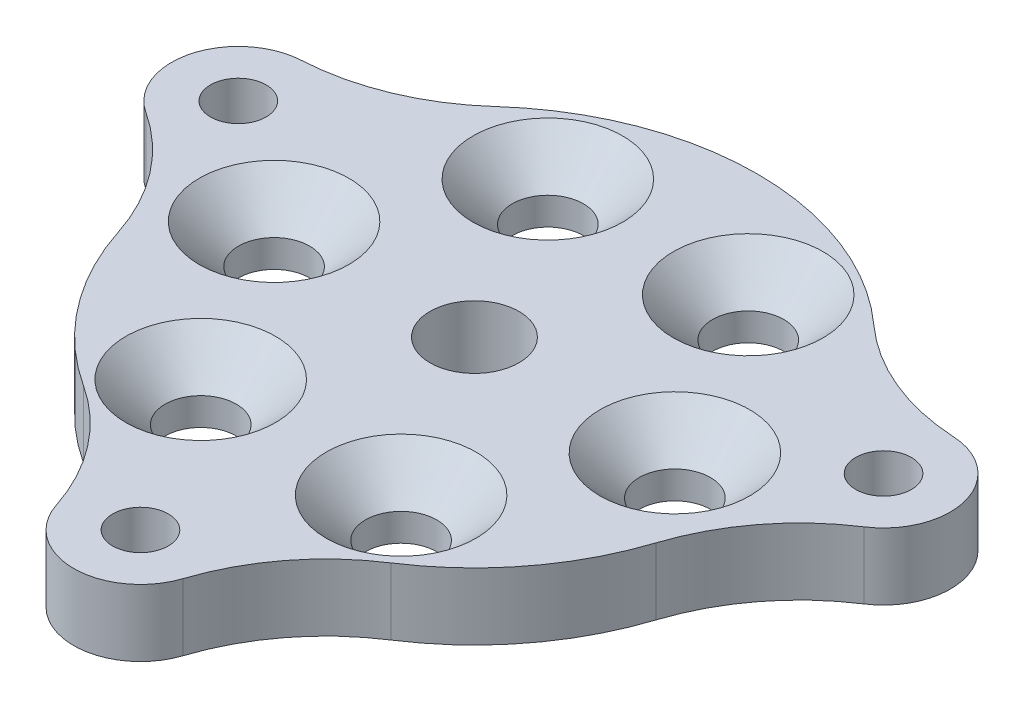
ISO-10303-21;
HEADER;
FILE_DESCRIPTION(('STEP AP214'),'2;1');
FILE_NAME('part.step','',(''),(''),'','','');
FILE_SCHEMA(('AUTOMOTIVE_DESIGN { 1 0 10303 214 1 1 1 1 }'));
ENDSEC;
DATA;
#1=APPLICATION_CONTEXT('core data for automotive mechanical design processes');
#2=APPLICATION_PROTOCOL_DEFINITION('international standard','automotive_design',2000,#1);
#3=PRODUCT_CONTEXT('',#1,'mechanical');
#4=PRODUCT('Part','Part','',(#3));
#5=PRODUCT_RELATED_PRODUCT_CATEGORY('part','',(#4));
#6=PRODUCT_DEFINITION_FORMATION('','',#4);
#7=PRODUCT_DEFINITION_CONTEXT('part definition',#1,'design');
#8=PRODUCT_DEFINITION('design','',#6,#7);
#9=PRODUCT_DEFINITION_SHAPE('','',#8);
#10=(LENGTH_UNIT() NAMED_UNIT(*) SI_UNIT(.MILLI.,.METRE.));
#11=(NAMED_UNIT(*) PLANE_ANGLE_UNIT() SI_UNIT($,.RADIAN.));
#12=(NAMED_UNIT(*) SI_UNIT($,.STERADIAN.) SOLID_ANGLE_UNIT());
#13=UNCERTAINTY_MEASURE_WITH_UNIT(LENGTH_MEASURE(1.E-05),#10,'distance_accuracy_value','');
#14=(GEOMETRIC_REPRESENTATION_CONTEXT(3) GLOBAL_UNCERTAINTY_ASSIGNED_CONTEXT((#13)) GLOBAL_UNIT_ASSIGNED_CONTEXT((#10,
#11,#12)) REPRESENTATION_CONTEXT('',''));
#15=CARTESIAN_POINT('',(0.,0.,0.));
#16=DIRECTION('',(0.,0.,1.));
#17=DIRECTION('',(1.,0.,0.));
#18=AXIS2_PLACEMENT_3D('',#15,#16,#17);
#19=CARTESIAN_POINT('',(0.,3.,0.));
#20=DIRECTION('',(0.,-1.,0.));
#21=DIRECTION('',(0.,0.,-1.));
#22=AXIS2_PLACEMENT_3D('',#19,#20,#21);
#23=CYLINDRICAL_SURFACE('',#22,12.7);
#24=CARTESIAN_POINT('',(0.,0.,0.));
#25=DIRECTION('',(0.,1.,0.));
#26=DIRECTION('',(0.,0.,1.));
#27=AXIS2_PLACEMENT_3D('',#24,#25,#26);
#28=CIRCLE('',#27,12.7);
#29=CARTESIAN_POINT('',(8.50191211044675,0.,-9.43437811762063));
#30=VERTEX_POINT('',#29);
#31=CARTESIAN_POINT('',(-8.50191211044675,0.,-9.43437811762062));
#32=VERTEX_POINT('',#31);
#33=EDGE_CURVE('E204',#30,#32,#28,.T.);
#34=ORIENTED_EDGE('',*,*,#33,.T.);
#35=DIRECTION('',(0.,-1.,0.));
#36=VECTOR('',#35,1.);
#37=CARTESIAN_POINT('',(-8.50191211044675,3.,-9.43437811762062));
#38=LINE('',#37,#36);
#39=CARTESIAN_POINT('',(-8.50191211044675,3.,-9.43437811762062));
#40=VERTEX_POINT('',#39);
#41=EDGE_CURVE('E162',#32,#40,#38,.F.);
#42=ORIENTED_EDGE('',*,*,#41,.T.);
#43=CARTESIAN_POINT('',(0.,3.,0.));
#44=DIRECTION('',(0.,1.,0.));
#45=DIRECTION('',(0.,0.,1.));
#46=AXIS2_PLACEMENT_3D('',#43,#44,#45);
#47=CIRCLE('',#46,12.7);
#48=CARTESIAN_POINT('',(8.50191211044675,3.,-9.43437811762063));
#49=VERTEX_POINT('',#48);
#50=EDGE_CURVE('E147',#49,#40,#47,.T.);
#51=ORIENTED_EDGE('',*,*,#50,.F.);
#52=DIRECTION('',(0.,-1.,0.));
#53=VECTOR('',#52,1.);
#54=CARTESIAN_POINT('',(8.50191211044675,3.,-9.43437811762063));
#55=LINE('',#54,#53);
#56=EDGE_CURVE('E159',#49,#30,#55,.T.);
#57=ORIENTED_EDGE('',*,*,#56,.T.);
#58=EDGE_LOOP('',(#34,#42,#51,#57));
#59=FACE_BOUND('',#58,.T.);
#60=ADVANCED_FACE('F37',(#59),#23,.T.);
#61=CARTESIAN_POINT('',(-12.0800609271998,3.,3.919455063544));
#62=VERTEX_POINT('',#61);
#63=CARTESIAN_POINT('',(-6.91245270481478,3.,10.654013215859));
#64=VERTEX_POINT('',#63);
#65=EDGE_CURVE('E129',#62,#64,#47,.T.);
#66=ORIENTED_EDGE('',*,*,#65,.F.);
#67=DIRECTION('',(0.,-1.,0.));
#68=VECTOR('',#67,1.);
#69=CARTESIAN_POINT('',(-12.0800609271998,3.,3.919455063544));
#70=LINE('',#69,#68);
#71=CARTESIAN_POINT('',(-12.0800609271998,0.,3.919455063544));
#72=VERTEX_POINT('',#71);
#73=EDGE_CURVE('E143',#62,#72,#70,.T.);
#74=ORIENTED_EDGE('',*,*,#73,.T.);
#75=CARTESIAN_POINT('',(-6.91245270481478,0.,10.654013215859));
#76=VERTEX_POINT('',#75);
#77=EDGE_CURVE('E285',#72,#76,#28,.T.);
#78=ORIENTED_EDGE('',*,*,#77,.T.);
#79=DIRECTION('',(0.,-1.,0.));
#80=VECTOR('',#79,1.);
#81=CARTESIAN_POINT('',(-6.91245270481478,3.,10.654013215859));
#82=LINE('',#81,#80);
#83=EDGE_CURVE('E146',#76,#64,#82,.F.);
#84=ORIENTED_EDGE('',*,*,#83,.T.);
#85=EDGE_LOOP('',(#66,#74,#78,#84));
#86=FACE_BOUND('',#85,.T.);
#87=ADVANCED_FACE('F141',(#86),#23,.T.);
#88=CARTESIAN_POINT('',(0.,3.,0.));
#89=DIRECTION('',(0.,1.,0.));
#90=DIRECTION('',(0.,0.,1.));
#91=AXIS2_PLACEMENT_3D('',#88,#89,#90);
#92=PLANE('',#91);
#93=CARTESIAN_POINT('',(-14.488887394336,3.,-3.88228567653787));
#94=DIRECTION('',(0.,1.,0.));
#95=DIRECTION('',(0.,0.,1.));
#96=AXIS2_PLACEMENT_3D('',#93,#94,#95);
#97=CIRCLE('',#96,1.25);
#98=CARTESIAN_POINT('',(-14.488887394336,3.,-2.63228567653787));
#99=VERTEX_POINT('',#98);
#100=EDGE_CURVE('E317',#99,#99,#97,.T.);
#101=ORIENTED_EDGE('',*,*,#100,.F.);
#102=EDGE_LOOP('',(#101));
#103=FACE_BOUND('',#102,.T.);
#104=CARTESIAN_POINT('',(14.488887394336,3.,-3.88228567653788));
#105=DIRECTION('',(0.,1.,0.));
#106=DIRECTION('',(0.,0.,1.));
#107=AXIS2_PLACEMENT_3D('',#104,#105,#106);
#108=CIRCLE('',#107,1.25);
#109=CARTESIAN_POINT('',(14.488887394336,3.,-2.63228567653788));
#110=VERTEX_POINT('',#109);
#111=EDGE_CURVE('E311',#110,#110,#108,.T.);
#112=ORIENTED_EDGE('',*,*,#111,.F.);
#113=EDGE_LOOP('',(#112));
#114=FACE_BOUND('',#113,.T.);
#115=CARTESIAN_POINT('',(0.,3.,15.));
#116=DIRECTION('',(0.,1.,0.));
#117=DIRECTION('',(0.,0.,1.));
#118=AXIS2_PLACEMENT_3D('',#115,#116,#117);
#119=CIRCLE('',#118,1.25);
#120=CARTESIAN_POINT('',(0.,3.,16.25));
#121=VERTEX_POINT('',#120);
#122=EDGE_CURVE('E303',#121,#121,#119,.T.);
#123=ORIENTED_EDGE('',*,*,#122,.F.);
#124=EDGE_LOOP('',(#123));
#125=FACE_BOUND('',#124,.T.);
#126=CARTESIAN_POINT('',(14.488887394336,3.,-3.88228567653788));
#127=DIRECTION('',(0.,1.,0.));
#128=DIRECTION('',(0.,0.,1.));
#129=AXIS2_PLACEMENT_3D('',#126,#127,#128);
#130=CIRCLE('',#129,3.);
#131=CARTESIAN_POINT('',(16.128048747565,3.,-1.36968740819481));
#132=VERTEX_POINT('',#131);
#133=CARTESIAN_POINT('',(14.6521436329624,3.,-6.87784028304225));
#134=VERTEX_POINT('',#133);
#135=EDGE_CURVE('E216',#132,#134,#130,.T.);
#136=ORIENTED_EDGE('',*,*,#135,.T.);
#137=CARTESIAN_POINT('',(15.1963310950505,3.,-16.8630223047235));
#138=DIRECTION('',(0.,1.,0.));
#139=DIRECTION('',(0.,0.,1.));
#140=AXIS2_PLACEMENT_3D('',#137,#138,#139);
#141=CIRCLE('',#140,10.);
#142=EDGE_CURVE('E184',#134,#49,#141,.F.);
#143=ORIENTED_EDGE('',*,*,#142,.T.);
#144=ORIENTED_EDGE('',*,*,#50,.T.);
#145=CARTESIAN_POINT('',(-15.1963310950505,3.,-16.8630223047235));
#146=DIRECTION('',(0.,1.,0.));
#147=DIRECTION('',(0.,0.,1.));
#148=AXIS2_PLACEMENT_3D('',#145,#146,#147);
#149=CIRCLE('',#148,10.);
#150=CARTESIAN_POINT('',(-14.6521436329624,3.,-6.87784028304224));
#151=VERTEX_POINT('',#150);
#152=EDGE_CURVE('E135',#40,#151,#149,.F.);
#153=ORIENTED_EDGE('',*,*,#152,.T.);
#154=CARTESIAN_POINT('',(-14.488887394336,3.,-3.88228567653787));
#155=DIRECTION('',(0.,1.,0.));
#156=DIRECTION('',(0.,0.,-1.));
#157=AXIS2_PLACEMENT_3D('',#154,#155,#156);
#158=CIRCLE('',#157,3.);
#159=CARTESIAN_POINT('',(-16.128048747565,3.,-1.36968740819481));
#160=VERTEX_POINT('',#159);
#161=EDGE_CURVE('E131',#151,#160,#158,.T.);
#162=ORIENTED_EDGE('',*,*,#161,.T.);
#163=CARTESIAN_POINT('',(-21.5919199249949,3.,7.00564015294872));
#164=DIRECTION('',(0.,1.,0.));
#165=DIRECTION('',(0.,0.,1.));
#166=AXIS2_PLACEMENT_3D('',#163,#164,#165);
#167=CIRCLE('',#166,10.);
#168=EDGE_CURVE('E124',#160,#62,#167,.F.);
#169=ORIENTED_EDGE('',*,*,#168,.T.);
#170=ORIENTED_EDGE('',*,*,#65,.T.);
#171=CARTESIAN_POINT('',(-12.3553288503382,3.,19.043));
#172=DIRECTION('',(0.,1.,0.));
#173=DIRECTION('',(0.,0.,1.));
#174=AXIS2_PLACEMENT_3D('',#171,#172,#173);
#175=CIRCLE('',#174,10.);
#176=CARTESIAN_POINT('',(-2.85122973469343,3.,15.933));
#177=VERTEX_POINT('',#176);
#178=EDGE_CURVE('E45',#64,#177,#175,.F.);
#179=ORIENTED_EDGE('',*,*,#178,.T.);
#180=CARTESIAN_POINT('',(0.,3.,15.));
#181=DIRECTION('',(0.,1.,0.));
#182=DIRECTION('',(0.,0.,1.));
#183=AXIS2_PLACEMENT_3D('',#180,#181,#182);
#184=CIRCLE('',#183,3.);
#185=CARTESIAN_POINT('',(2.85122973469344,3.,15.933));
#186=VERTEX_POINT('',#185);
#187=EDGE_CURVE('E196',#177,#186,#184,.T.);
#188=ORIENTED_EDGE('',*,*,#187,.T.);
#189=CARTESIAN_POINT('',(12.3553288503382,3.,19.043));
#190=DIRECTION('',(0.,1.,0.));
#191=DIRECTION('',(0.,0.,1.));
#192=AXIS2_PLACEMENT_3D('',#189,#190,#191);
#193=CIRCLE('',#192,10.);
#194=CARTESIAN_POINT('',(6.91245270481478,3.,10.654013215859));
#195=VERTEX_POINT('',#194);
#196=EDGE_CURVE('E192',#186,#195,#193,.F.);
#197=ORIENTED_EDGE('',*,*,#196,.T.);
#198=CARTESIAN_POINT('',(12.0800609271998,3.,3.919455063544));
#199=VERTEX_POINT('',#198);
#200=EDGE_CURVE('E148',#195,#199,#47,.T.);
#201=ORIENTED_EDGE('',*,*,#200,.T.);
#202=CARTESIAN_POINT('',(21.5919199249949,3.,7.00564015294872));
#203=DIRECTION('',(0.,1.,0.));
#204=DIRECTION('',(0.,0.,1.));
#205=AXIS2_PLACEMENT_3D('',#202,#203,#204);
#206=CIRCLE('',#205,10.);
#207=EDGE_CURVE('E186',#199,#132,#206,.F.);
#208=ORIENTED_EDGE('',*,*,#207,.T.);
#209=EDGE_LOOP('',(#136,#143,#144,#153,#162,#169,#170,#179,#188,#197,#201,#208));
#210=FACE_BOUND('',#209,.T.);
#211=CARTESIAN_POINT('',(-4.5,3.,-7.79422863405995));
#212=DIRECTION('',(0.,1.,0.));
#213=DIRECTION('',(0.,0.,1.));
#214=AXIS2_PLACEMENT_3D('',#211,#212,#213);
#215=CIRCLE('',#214,3.36);
#216=CARTESIAN_POINT('',(-4.5,3.,-4.43422863405995));
#217=VERTEX_POINT('',#216);
#218=EDGE_CURVE('E226',#217,#217,#215,.T.);
#219=ORIENTED_EDGE('',*,*,#218,.F.);
#220=EDGE_LOOP('',(#219));
#221=FACE_BOUND('',#220,.T.);
#222=CARTESIAN_POINT('',(4.5,3.,-7.79422863405995));
#223=DIRECTION('',(0.,1.,0.));
#224=DIRECTION('',(0.,0.,1.));
#225=AXIS2_PLACEMENT_3D('',#222,#223,#224);
#226=CIRCLE('',#225,3.36);
#227=CARTESIAN_POINT('',(4.5,3.,-4.43422863405995));
#228=VERTEX_POINT('',#227);
#229=EDGE_CURVE('E235',#228,#228,#226,.T.);
#230=ORIENTED_EDGE('',*,*,#229,.F.);
#231=EDGE_LOOP('',(#230));
#232=FACE_BOUND('',#231,.T.);
#233=CARTESIAN_POINT('',(9.,3.,0.));
#234=DIRECTION('',(0.,1.,0.));
#235=DIRECTION('',(0.,0.,1.));
#236=AXIS2_PLACEMENT_3D('',#233,#234,#235);
#237=CIRCLE('',#236,3.36);
#238=CARTESIAN_POINT('',(9.,3.,3.36));
#239=VERTEX_POINT('',#238);
#240=EDGE_CURVE('E244',#239,#239,#237,.T.);
#241=ORIENTED_EDGE('',*,*,#240,.F.);
#242=EDGE_LOOP('',(#241));
#243=FACE_BOUND('',#242,.T.);
#244=CARTESIAN_POINT('',(4.5,3.,7.79422863405995));
#245=DIRECTION('',(0.,1.,0.));
#246=DIRECTION('',(0.,0.,1.));
#247=AXIS2_PLACEMENT_3D('',#244,#245,#246);
#248=CIRCLE('',#247,3.36);
#249=CARTESIAN_POINT('',(4.5,3.,11.1542286340599));
#250=VERTEX_POINT('',#249);
#251=EDGE_CURVE('E253',#250,#250,#248,.T.);
#252=ORIENTED_EDGE('',*,*,#251,.F.);
#253=EDGE_LOOP('',(#252));
#254=FACE_BOUND('',#253,.T.);
#255=CARTESIAN_POINT('',(-4.5,3.,7.79422863405995));
#256=DIRECTION('',(0.,1.,0.));
#257=DIRECTION('',(0.,0.,1.));
#258=AXIS2_PLACEMENT_3D('',#255,#256,#257);
#259=CIRCLE('',#258,3.36);
#260=CARTESIAN_POINT('',(-4.5,3.,11.15422863406));
#261=VERTEX_POINT('',#260);
#262=EDGE_CURVE('E262',#261,#261,#259,.T.);
#263=ORIENTED_EDGE('',*,*,#262,.F.);
#264=EDGE_LOOP('',(#263));
#265=FACE_BOUND('',#264,.T.);
#266=CARTESIAN_POINT('',(-9.,3.,0.));
#267=DIRECTION('',(0.,1.,0.));
#268=DIRECTION('',(0.,0.,1.));
#269=AXIS2_PLACEMENT_3D('',#266,#267,#268);
#270=CIRCLE('',#269,3.36);
#271=CARTESIAN_POINT('',(-9.,3.,3.36));
#272=VERTEX_POINT('',#271);
#273=EDGE_CURVE('E271',#272,#272,#270,.T.);
#274=ORIENTED_EDGE('',*,*,#273,.F.);
#275=EDGE_LOOP('',(#274));
#276=FACE_BOUND('',#275,.T.);
#277=CARTESIAN_POINT('',(0.,3.,0.));
#278=DIRECTION('',(0.,1.,0.));
#279=DIRECTION('',(0.,0.,1.));
#280=AXIS2_PLACEMENT_3D('',#277,#278,#279);
#281=CIRCLE('',#280,2.);
#282=CARTESIAN_POINT('',(0.,3.,2.));
#283=VERTEX_POINT('',#282);
#284=EDGE_CURVE('E281',#283,#283,#281,.T.);
#285=ORIENTED_EDGE('',*,*,#284,.F.);
#286=EDGE_LOOP('',(#285));
#287=FACE_BOUND('',#286,.T.);
#288=ADVANCED_FACE('F127',(#103,#114,#125,#210,#221,#232,#243,#254,#265,#276,#287),#92,.T.);
#289=CARTESIAN_POINT('',(0.,0.,0.));
#290=DIRECTION('',(0.,1.,0.));
#291=DIRECTION('',(0.,0.,1.));
#292=AXIS2_PLACEMENT_3D('',#289,#290,#291);
#293=PLANE('',#292);
#294=CARTESIAN_POINT('',(-14.488887394336,0.,-3.88228567653787));
#295=DIRECTION('',(0.,1.,0.));
#296=DIRECTION('',(0.,0.,1.));
#297=AXIS2_PLACEMENT_3D('',#294,#295,#296);
#298=CIRCLE('',#297,1.25);
#299=CARTESIAN_POINT('',(-14.488887394336,0.,-2.63228567653787));
#300=VERTEX_POINT('',#299);
#301=EDGE_CURVE('E314',#300,#300,#298,.T.);
#302=ORIENTED_EDGE('',*,*,#301,.T.);
#303=EDGE_LOOP('',(#302));
#304=FACE_BOUND('',#303,.T.);
#305=CARTESIAN_POINT('',(14.488887394336,0.,-3.88228567653788));
#306=DIRECTION('',(0.,1.,0.));
#307=DIRECTION('',(0.,0.,1.));
#308=AXIS2_PLACEMENT_3D('',#305,#306,#307);
#309=CIRCLE('',#308,1.25);
#310=CARTESIAN_POINT('',(14.488887394336,0.,-2.63228567653788));
#311=VERTEX_POINT('',#310);
#312=EDGE_CURVE('E308',#311,#311,#309,.T.);
#313=ORIENTED_EDGE('',*,*,#312,.T.);
#314=EDGE_LOOP('',(#313));
#315=FACE_BOUND('',#314,.T.);
#316=CARTESIAN_POINT('',(0.,0.,15.));
#317=DIRECTION('',(0.,1.,0.));
#318=DIRECTION('',(0.,0.,1.));
#319=AXIS2_PLACEMENT_3D('',#316,#317,#318);
#320=CIRCLE('',#319,1.25);
#321=CARTESIAN_POINT('',(0.,0.,16.25));
#322=VERTEX_POINT('',#321);
#323=EDGE_CURVE('E301',#322,#322,#320,.T.);
#324=ORIENTED_EDGE('',*,*,#323,.T.);
#325=EDGE_LOOP('',(#324));
#326=FACE_BOUND('',#325,.T.);
#327=CARTESIAN_POINT('',(-4.5,0.,-7.79422863405995));
#328=DIRECTION('',(0.,1.,0.));
#329=DIRECTION('',(0.,0.,1.));
#330=AXIS2_PLACEMENT_3D('',#327,#328,#329);
#331=CIRCLE('',#330,1.6);
#332=CARTESIAN_POINT('',(-4.5,0.,-6.19422863405995));
#333=VERTEX_POINT('',#332);
#334=EDGE_CURVE('E232',#333,#333,#331,.T.);
#335=ORIENTED_EDGE('',*,*,#334,.T.);
#336=EDGE_LOOP('',(#335));
#337=FACE_BOUND('',#336,.T.);
#338=CARTESIAN_POINT('',(4.5,0.,-7.79422863405995));
#339=DIRECTION('',(0.,1.,0.));
#340=DIRECTION('',(0.,0.,1.));
#341=AXIS2_PLACEMENT_3D('',#338,#339,#340);
#342=CIRCLE('',#341,1.6);
#343=CARTESIAN_POINT('',(4.5,0.,-6.19422863405995));
#344=VERTEX_POINT('',#343);
#345=EDGE_CURVE('E241',#344,#344,#342,.T.);
#346=ORIENTED_EDGE('',*,*,#345,.T.);
#347=EDGE_LOOP('',(#346));
#348=FACE_BOUND('',#347,.T.);
#349=CARTESIAN_POINT('',(9.,0.,0.));
#350=DIRECTION('',(0.,1.,0.));
#351=DIRECTION('',(0.,0.,1.));
#352=AXIS2_PLACEMENT_3D('',#349,#350,#351);
#353=CIRCLE('',#352,1.6);
#354=CARTESIAN_POINT('',(9.,0.,1.59999999999999));
#355=VERTEX_POINT('',#354);
#356=EDGE_CURVE('E250',#355,#355,#353,.T.);
#357=ORIENTED_EDGE('',*,*,#356,.T.);
#358=EDGE_LOOP('',(#357));
#359=FACE_BOUND('',#358,.T.);
#360=CARTESIAN_POINT('',(4.5,0.,7.79422863405995));
#361=DIRECTION('',(0.,1.,0.));
#362=DIRECTION('',(0.,0.,1.));
#363=AXIS2_PLACEMENT_3D('',#360,#361,#362);
#364=CIRCLE('',#363,1.6);
#365=CARTESIAN_POINT('',(4.5,0.,9.39422863405994));
#366=VERTEX_POINT('',#365);
#367=EDGE_CURVE('E259',#366,#366,#364,.T.);
#368=ORIENTED_EDGE('',*,*,#367,.T.);
#369=EDGE_LOOP('',(#368));
#370=FACE_BOUND('',#369,.T.);
#371=CARTESIAN_POINT('',(-4.5,0.,7.79422863405995));
#372=DIRECTION('',(0.,1.,0.));
#373=DIRECTION('',(0.,0.,1.));
#374=AXIS2_PLACEMENT_3D('',#371,#372,#373);
#375=CIRCLE('',#374,1.6);
#376=CARTESIAN_POINT('',(-4.5,0.,9.39422863405995));
#377=VERTEX_POINT('',#376);
#378=EDGE_CURVE('E268',#377,#377,#375,.T.);
#379=ORIENTED_EDGE('',*,*,#378,.T.);
#380=EDGE_LOOP('',(#379));
#381=FACE_BOUND('',#380,.T.);
#382=CARTESIAN_POINT('',(-9.,0.,0.));
#383=DIRECTION('',(0.,1.,0.));
#384=DIRECTION('',(0.,0.,1.));
#385=AXIS2_PLACEMENT_3D('',#382,#383,#384);
#386=CIRCLE('',#385,1.6);
#387=CARTESIAN_POINT('',(-9.,0.,1.59999999999999));
#388=VERTEX_POINT('',#387);
#389=EDGE_CURVE('E277',#388,#388,#386,.T.);
#390=ORIENTED_EDGE('',*,*,#389,.T.);
#391=EDGE_LOOP('',(#390));
#392=FACE_BOUND('',#391,.T.);
#393=ORIENTED_EDGE('',*,*,#77,.F.);
#394=CARTESIAN_POINT('',(-21.5919199249949,0.,7.00564015294872));
#395=DIRECTION('',(0.,1.,0.));
#396=DIRECTION('',(0.,0.,1.));
#397=AXIS2_PLACEMENT_3D('',#394,#395,#396);
#398=CIRCLE('',#397,10.);
#399=CARTESIAN_POINT('',(-16.128048747565,0.,-1.36968740819481));
#400=VERTEX_POINT('',#399);
#401=EDGE_CURVE('E136',#72,#400,#398,.T.);
#402=ORIENTED_EDGE('',*,*,#401,.T.);
#403=CARTESIAN_POINT('',(-14.488887394336,0.,-3.88228567653787));
#404=DIRECTION('',(0.,1.,0.));
#405=DIRECTION('',(0.,0.,1.));
#406=AXIS2_PLACEMENT_3D('',#403,#404,#405);
#407=CIRCLE('',#406,3.);
#408=CARTESIAN_POINT('',(-14.6521436329624,0.,-6.87784028304224));
#409=VERTEX_POINT('',#408);
#410=EDGE_CURVE('E218',#400,#409,#407,.F.);
#411=ORIENTED_EDGE('',*,*,#410,.T.);
#412=CARTESIAN_POINT('',(-15.1963310950505,0.,-16.8630223047235));
#413=DIRECTION('',(0.,1.,0.));
#414=DIRECTION('',(0.,0.,1.));
#415=AXIS2_PLACEMENT_3D('',#412,#413,#414);
#416=CIRCLE('',#415,10.);
#417=EDGE_CURVE('E180',#409,#32,#416,.T.);
#418=ORIENTED_EDGE('',*,*,#417,.T.);
#419=ORIENTED_EDGE('',*,*,#33,.F.);
#420=CARTESIAN_POINT('',(15.1963310950505,0.,-16.8630223047235));
#421=DIRECTION('',(0.,1.,0.));
#422=DIRECTION('',(0.,0.,1.));
#423=AXIS2_PLACEMENT_3D('',#420,#421,#422);
#424=CIRCLE('',#423,10.);
#425=CARTESIAN_POINT('',(14.6521436329624,0.,-6.87784028304225));
#426=VERTEX_POINT('',#425);
#427=EDGE_CURVE('E182',#30,#426,#424,.T.);
#428=ORIENTED_EDGE('',*,*,#427,.T.);
#429=CARTESIAN_POINT('',(14.488887394336,0.,-3.88228567653788));
#430=DIRECTION('',(0.,1.,0.));
#431=DIRECTION('',(0.,0.,1.));
#432=AXIS2_PLACEMENT_3D('',#429,#430,#431);
#433=CIRCLE('',#432,3.);
#434=CARTESIAN_POINT('',(16.128048747565,0.,-1.36968740819481));
#435=VERTEX_POINT('',#434);
#436=EDGE_CURVE('E223',#426,#435,#433,.F.);
#437=ORIENTED_EDGE('',*,*,#436,.T.);
#438=CARTESIAN_POINT('',(21.5919199249949,0.,7.00564015294872));
#439=DIRECTION('',(0.,1.,0.));
#440=DIRECTION('',(0.,0.,1.));
#441=AXIS2_PLACEMENT_3D('',#438,#439,#440);
#442=CIRCLE('',#441,10.);
#443=CARTESIAN_POINT('',(12.0800609271998,0.,3.919455063544));
#444=VERTEX_POINT('',#443);
#445=EDGE_CURVE('E188',#435,#444,#442,.T.);
#446=ORIENTED_EDGE('',*,*,#445,.T.);
#447=CARTESIAN_POINT('',(6.91245270481478,0.,10.654013215859));
#448=VERTEX_POINT('',#447);
#449=EDGE_CURVE('E212',#448,#444,#28,.T.);
#450=ORIENTED_EDGE('',*,*,#449,.F.);
#451=CARTESIAN_POINT('',(12.3553288503382,0.,19.043));
#452=DIRECTION('',(0.,1.,0.));
#453=DIRECTION('',(0.,0.,1.));
#454=AXIS2_PLACEMENT_3D('',#451,#452,#453);
#455=CIRCLE('',#454,10.);
#456=CARTESIAN_POINT('',(2.85122973469344,0.,15.933));
#457=VERTEX_POINT('',#456);
#458=EDGE_CURVE('E190',#448,#457,#455,.T.);
#459=ORIENTED_EDGE('',*,*,#458,.T.);
#460=CARTESIAN_POINT('',(0.,0.,15.));
#461=DIRECTION('',(0.,1.,0.));
#462=DIRECTION('',(0.,0.,1.));
#463=AXIS2_PLACEMENT_3D('',#460,#461,#462);
#464=CIRCLE('',#463,3.);
#465=CARTESIAN_POINT('',(-2.85122973469343,0.,15.933));
#466=VERTEX_POINT('',#465);
#467=EDGE_CURVE('E210',#457,#466,#464,.F.);
#468=ORIENTED_EDGE('',*,*,#467,.T.);
#469=CARTESIAN_POINT('',(-12.3553288503382,0.,19.043));
#470=DIRECTION('',(0.,1.,0.));
#471=DIRECTION('',(0.,0.,1.));
#472=AXIS2_PLACEMENT_3D('',#469,#470,#471);
#473=CIRCLE('',#472,10.);
#474=EDGE_CURVE('E11',#466,#76,#473,.T.);
#475=ORIENTED_EDGE('',*,*,#474,.T.);
#476=EDGE_LOOP('',(#393,#402,#411,#418,#419,#428,#437,#446,#450,#459,#468,#475));
#477=FACE_BOUND('',#476,.T.);
#478=CARTESIAN_POINT('',(0.,0.,0.));
#479=DIRECTION('',(0.,1.,0.));
#480=DIRECTION('',(0.,0.,1.));
#481=AXIS2_PLACEMENT_3D('',#478,#479,#480);
#482=CIRCLE('',#481,2.);
#483=CARTESIAN_POINT('',(0.,0.,2.));
#484=VERTEX_POINT('',#483);
#485=EDGE_CURVE('E280',#484,#484,#482,.T.);
#486=ORIENTED_EDGE('',*,*,#485,.T.);
#487=EDGE_LOOP('',(#486));
#488=FACE_BOUND('',#487,.T.);
#489=ADVANCED_FACE('F208',(#304,#315,#326,#337,#348,#359,#370,#381,#392,#477,#488),#293,.F.);
#490=ORIENTED_EDGE('',*,*,#449,.T.);
#491=DIRECTION('',(0.,-1.,0.));
#492=VECTOR('',#491,1.);
#493=CARTESIAN_POINT('',(12.0800609271998,3.,3.919455063544));
#494=LINE('',#493,#492);
#495=EDGE_CURVE('E172',#444,#199,#494,.F.);
#496=ORIENTED_EDGE('',*,*,#495,.T.);
#497=ORIENTED_EDGE('',*,*,#200,.F.);
#498=DIRECTION('',(0.,-1.,0.));
#499=VECTOR('',#498,1.);
#500=CARTESIAN_POINT('',(6.91245270481478,3.,10.654013215859));
#501=LINE('',#500,#499);
#502=EDGE_CURVE('E169',#195,#448,#501,.T.);
#503=ORIENTED_EDGE('',*,*,#502,.T.);
#504=EDGE_LOOP('',(#490,#496,#497,#503));
#505=FACE_BOUND('',#504,.T.);
#506=ADVANCED_FACE('F201',(#505),#23,.T.);
#507=CARTESIAN_POINT('',(0.,3.,0.));
#508=DIRECTION('',(0.,-1.,0.));
#509=DIRECTION('',(0.,0.,-1.));
#510=AXIS2_PLACEMENT_3D('',#507,#508,#509);
#511=CYLINDRICAL_SURFACE('',#510,2.);
#512=ORIENTED_EDGE('',*,*,#284,.T.);
#513=EDGE_LOOP('',(#512));
#514=FACE_BOUND('',#513,.T.);
#515=ORIENTED_EDGE('',*,*,#485,.F.);
#516=EDGE_LOOP('',(#515));
#517=FACE_BOUND('',#516,.T.);
#518=ADVANCED_FACE('F353',(#514,#517),#511,.F.);
#519=CARTESIAN_POINT('',(-9.,3.,0.));
#520=DIRECTION('',(0.,1.,0.));
#521=DIRECTION('',(0.,0.,1.));
#522=AXIS2_PLACEMENT_3D('',#519,#520,#521);
#523=CYLINDRICAL_SURFACE('',#522,1.6);
#524=ORIENTED_EDGE('',*,*,#389,.F.);
#525=EDGE_LOOP('',(#524));
#526=FACE_BOUND('',#525,.T.);
#527=CARTESIAN_POINT('',(-9.,1.24,0.));
#528=DIRECTION('',(0.,1.,0.));
#529=DIRECTION('',(0.,0.,1.));
#530=AXIS2_PLACEMENT_3D('',#527,#528,#529);
#531=CIRCLE('',#530,1.6);
#532=CARTESIAN_POINT('',(-9.,1.24,1.59999999999999));
#533=VERTEX_POINT('',#532);
#534=EDGE_CURVE('E274',#533,#533,#531,.T.);
#535=ORIENTED_EDGE('',*,*,#534,.T.);
#536=EDGE_LOOP('',(#535));
#537=FACE_BOUND('',#536,.T.);
#538=ADVANCED_FACE('F358',(#526,#537),#523,.F.);
#539=CARTESIAN_POINT('',(-9.,3.,0.));
#540=DIRECTION('',(0.,1.,0.));
#541=DIRECTION('',(0.,0.,1.));
#542=AXIS2_PLACEMENT_3D('',#539,#540,#541);
#543=CONICAL_SURFACE('',#542,3.36,0.78539816339745);
#544=ORIENTED_EDGE('',*,*,#534,.F.);
#545=EDGE_LOOP('',(#544));
#546=FACE_BOUND('',#545,.T.);
#547=ORIENTED_EDGE('',*,*,#273,.T.);
#548=EDGE_LOOP('',(#547));
#549=FACE_BOUND('',#548,.T.);
#550=ADVANCED_FACE('F369',(#546,#549),#543,.F.);
#551=CARTESIAN_POINT('',(-4.5,3.,7.79422863405995));
#552=DIRECTION('',(0.,1.,0.));
#553=DIRECTION('',(0.,0.,1.));
#554=AXIS2_PLACEMENT_3D('',#551,#552,#553);
#555=CYLINDRICAL_SURFACE('',#554,1.6);
#556=ORIENTED_EDGE('',*,*,#378,.F.);
#557=EDGE_LOOP('',(#556));
#558=FACE_BOUND('',#557,.T.);
#559=CARTESIAN_POINT('',(-4.5,1.24,7.79422863405995));
#560=DIRECTION('',(0.,1.,0.));
#561=DIRECTION('',(0.,0.,1.));
#562=AXIS2_PLACEMENT_3D('',#559,#560,#561);
#563=CIRCLE('',#562,1.6);
#564=CARTESIAN_POINT('',(-4.5,1.24,9.39422863405995));
#565=VERTEX_POINT('',#564);
#566=EDGE_CURVE('E265',#565,#565,#563,.T.);
#567=ORIENTED_EDGE('',*,*,#566,.T.);
#568=EDGE_LOOP('',(#567));
#569=FACE_BOUND('',#568,.T.);
#570=ADVANCED_FACE('F373',(#558,#569),#555,.F.);
#571=CARTESIAN_POINT('',(-4.5,3.,7.79422863405995));
#572=DIRECTION('',(0.,1.,0.));
#573=DIRECTION('',(0.,0.,1.));
#574=AXIS2_PLACEMENT_3D('',#571,#572,#573);
#575=CONICAL_SURFACE('',#574,3.36,0.78539816339745);
#576=ORIENTED_EDGE('',*,*,#566,.F.);
#577=EDGE_LOOP('',(#576));
#578=FACE_BOUND('',#577,.T.);
#579=ORIENTED_EDGE('',*,*,#262,.T.);
#580=EDGE_LOOP('',(#579));
#581=FACE_BOUND('',#580,.T.);
#582=ADVANCED_FACE('F377',(#578,#581),#575,.F.);
#583=CARTESIAN_POINT('',(4.5,3.,7.79422863405995));
#584=DIRECTION('',(0.,1.,0.));
#585=DIRECTION('',(0.,0.,1.));
#586=AXIS2_PLACEMENT_3D('',#583,#584,#585);
#587=CYLINDRICAL_SURFACE('',#586,1.6);
#588=ORIENTED_EDGE('',*,*,#367,.F.);
#589=EDGE_LOOP('',(#588));
#590=FACE_BOUND('',#589,.T.);
#591=CARTESIAN_POINT('',(4.5,1.24,7.79422863405995));
#592=DIRECTION('',(0.,1.,0.));
#593=DIRECTION('',(0.,0.,1.));
#594=AXIS2_PLACEMENT_3D('',#591,#592,#593);
#595=CIRCLE('',#594,1.6);
#596=CARTESIAN_POINT('',(4.5,1.24,9.39422863405994));
#597=VERTEX_POINT('',#596);
#598=EDGE_CURVE('E256',#597,#597,#595,.T.);
#599=ORIENTED_EDGE('',*,*,#598,.T.);
#600=EDGE_LOOP('',(#599));
#601=FACE_BOUND('',#600,.T.);
#602=ADVANCED_FACE('F381',(#590,#601),#587,.F.);
#603=CARTESIAN_POINT('',(4.5,3.,7.79422863405995));
#604=DIRECTION('',(0.,1.,0.));
#605=DIRECTION('',(0.,0.,1.));
#606=AXIS2_PLACEMENT_3D('',#603,#604,#605);
#607=CONICAL_SURFACE('',#606,3.36,0.78539816339745);
#608=ORIENTED_EDGE('',*,*,#598,.F.);
#609=EDGE_LOOP('',(#608));
#610=FACE_BOUND('',#609,.T.);
#611=ORIENTED_EDGE('',*,*,#251,.T.);
#612=EDGE_LOOP('',(#611));
#613=FACE_BOUND('',#612,.T.);
#614=ADVANCED_FACE('F385',(#610,#613),#607,.F.);
#615=CARTESIAN_POINT('',(9.,3.,0.));
#616=DIRECTION('',(0.,1.,0.));
#617=DIRECTION('',(0.,0.,1.));
#618=AXIS2_PLACEMENT_3D('',#615,#616,#617);
#619=CYLINDRICAL_SURFACE('',#618,1.6);
#620=ORIENTED_EDGE('',*,*,#356,.F.);
#621=EDGE_LOOP('',(#620));
#622=FACE_BOUND('',#621,.T.);
#623=CARTESIAN_POINT('',(9.,1.24,0.));
#624=DIRECTION('',(0.,1.,0.));
#625=DIRECTION('',(0.,0.,1.));
#626=AXIS2_PLACEMENT_3D('',#623,#624,#625);
#627=CIRCLE('',#626,1.6);
#628=CARTESIAN_POINT('',(9.,1.24,1.59999999999999));
#629=VERTEX_POINT('',#628);
#630=EDGE_CURVE('E247',#629,#629,#627,.T.);
#631=ORIENTED_EDGE('',*,*,#630,.T.);
#632=EDGE_LOOP('',(#631));
#633=FACE_BOUND('',#632,.T.);
#634=ADVANCED_FACE('F389',(#622,#633),#619,.F.);
#635=CARTESIAN_POINT('',(9.,3.,0.));
#636=DIRECTION('',(0.,1.,0.));
#637=DIRECTION('',(0.,0.,1.));
#638=AXIS2_PLACEMENT_3D('',#635,#636,#637);
#639=CONICAL_SURFACE('',#638,3.36,0.78539816339745);
#640=ORIENTED_EDGE('',*,*,#630,.F.);
#641=EDGE_LOOP('',(#640));
#642=FACE_BOUND('',#641,.T.);
#643=ORIENTED_EDGE('',*,*,#240,.T.);
#644=EDGE_LOOP('',(#643));
#645=FACE_BOUND('',#644,.T.);
#646=ADVANCED_FACE('F393',(#642,#645),#639,.F.);
#647=CARTESIAN_POINT('',(4.5,3.,-7.79422863405995));
#648=DIRECTION('',(0.,1.,0.));
#649=DIRECTION('',(0.,0.,1.));
#650=AXIS2_PLACEMENT_3D('',#647,#648,#649);
#651=CYLINDRICAL_SURFACE('',#650,1.6);
#652=ORIENTED_EDGE('',*,*,#345,.F.);
#653=EDGE_LOOP('',(#652));
#654=FACE_BOUND('',#653,.T.);
#655=CARTESIAN_POINT('',(4.5,1.24,-7.79422863405995));
#656=DIRECTION('',(0.,1.,0.));
#657=DIRECTION('',(0.,0.,1.));
#658=AXIS2_PLACEMENT_3D('',#655,#656,#657);
#659=CIRCLE('',#658,1.6);
#660=CARTESIAN_POINT('',(4.5,1.24,-6.19422863405995));
#661=VERTEX_POINT('',#660);
#662=EDGE_CURVE('E238',#661,#661,#659,.T.);
#663=ORIENTED_EDGE('',*,*,#662,.T.);
#664=EDGE_LOOP('',(#663));
#665=FACE_BOUND('',#664,.T.);
#666=ADVANCED_FACE('F397',(#654,#665),#651,.F.);
#667=CARTESIAN_POINT('',(4.5,3.,-7.79422863405995));
#668=DIRECTION('',(0.,1.,0.));
#669=DIRECTION('',(0.,0.,1.));
#670=AXIS2_PLACEMENT_3D('',#667,#668,#669);
#671=CONICAL_SURFACE('',#670,3.36,0.78539816339745);
#672=ORIENTED_EDGE('',*,*,#662,.F.);
#673=EDGE_LOOP('',(#672));
#674=FACE_BOUND('',#673,.T.);
#675=ORIENTED_EDGE('',*,*,#229,.T.);
#676=EDGE_LOOP('',(#675));
#677=FACE_BOUND('',#676,.T.);
#678=ADVANCED_FACE('F401',(#674,#677),#671,.F.);
#679=CARTESIAN_POINT('',(-4.5,3.,-7.79422863405995));
#680=DIRECTION('',(0.,1.,0.));
#681=DIRECTION('',(0.,0.,1.));
#682=AXIS2_PLACEMENT_3D('',#679,#680,#681);
#683=CYLINDRICAL_SURFACE('',#682,1.6);
#684=ORIENTED_EDGE('',*,*,#334,.F.);
#685=EDGE_LOOP('',(#684));
#686=FACE_BOUND('',#685,.T.);
#687=CARTESIAN_POINT('',(-4.5,1.24,-7.79422863405995));
#688=DIRECTION('',(0.,1.,0.));
#689=DIRECTION('',(0.,0.,1.));
#690=AXIS2_PLACEMENT_3D('',#687,#688,#689);
#691=CIRCLE('',#690,1.6);
#692=CARTESIAN_POINT('',(-4.5,1.24,-6.19422863405995));
#693=VERTEX_POINT('',#692);
#694=EDGE_CURVE('E229',#693,#693,#691,.T.);
#695=ORIENTED_EDGE('',*,*,#694,.T.);
#696=EDGE_LOOP('',(#695));
#697=FACE_BOUND('',#696,.T.);
#698=ADVANCED_FACE('F405',(#686,#697),#683,.F.);
#699=CARTESIAN_POINT('',(-4.5,3.,-7.79422863405995));
#700=DIRECTION('',(0.,1.,0.));
#701=DIRECTION('',(0.,0.,1.));
#702=AXIS2_PLACEMENT_3D('',#699,#700,#701);
#703=CONICAL_SURFACE('',#702,3.36,0.78539816339745);
#704=ORIENTED_EDGE('',*,*,#694,.F.);
#705=EDGE_LOOP('',(#704));
#706=FACE_BOUND('',#705,.T.);
#707=ORIENTED_EDGE('',*,*,#218,.T.);
#708=EDGE_LOOP('',(#707));
#709=FACE_BOUND('',#708,.T.);
#710=ADVANCED_FACE('F409',(#706,#709),#703,.F.);
#711=CARTESIAN_POINT('',(14.488887394336,-8.48528137423858,-3.88228567653788));
#712=DIRECTION('',(0.,1.,0.));
#713=DIRECTION('',(0.,0.,1.));
#714=AXIS2_PLACEMENT_3D('',#711,#712,#713);
#715=CYLINDRICAL_SURFACE('',#714,3.);
#716=ORIENTED_EDGE('',*,*,#436,.F.);
#717=DIRECTION('',(0.,1.,0.));
#718=VECTOR('',#717,1.);
#719=CARTESIAN_POINT('',(14.6521436329624,-8.48528137423858,-6.87784028304225));
#720=LINE('',#719,#718);
#721=EDGE_CURVE('E167',#426,#134,#720,.T.);
#722=ORIENTED_EDGE('',*,*,#721,.T.);
#723=ORIENTED_EDGE('',*,*,#135,.F.);
#724=DIRECTION('',(0.,1.,0.));
#725=VECTOR('',#724,1.);
#726=CARTESIAN_POINT('',(16.128048747565,-8.48528137423858,-1.36968740819481));
#727=LINE('',#726,#725);
#728=EDGE_CURVE('E165',#132,#435,#727,.F.);
#729=ORIENTED_EDGE('',*,*,#728,.T.);
#730=EDGE_LOOP('',(#716,#722,#723,#729));
#731=FACE_BOUND('',#730,.T.);
#732=ADVANCED_FACE('F413',(#731),#715,.T.);
#733=CARTESIAN_POINT('',(0.,-8.48528137423858,15.));
#734=DIRECTION('',(0.,1.,0.));
#735=DIRECTION('',(0.,0.,1.));
#736=AXIS2_PLACEMENT_3D('',#733,#734,#735);
#737=CYLINDRICAL_SURFACE('',#736,3.);
#738=ORIENTED_EDGE('',*,*,#467,.F.);
#739=DIRECTION('',(0.,1.,0.));
#740=VECTOR('',#739,1.);
#741=CARTESIAN_POINT('',(2.85122973469344,-8.48528137423858,15.933));
#742=LINE('',#741,#740);
#743=EDGE_CURVE('E52',#457,#186,#742,.T.);
#744=ORIENTED_EDGE('',*,*,#743,.T.);
#745=ORIENTED_EDGE('',*,*,#187,.F.);
#746=DIRECTION('',(0.,1.,0.));
#747=VECTOR('',#746,1.);
#748=CARTESIAN_POINT('',(-2.85122973469343,-8.48528137423858,15.933));
#749=LINE('',#748,#747);
#750=EDGE_CURVE('E175',#177,#466,#749,.F.);
#751=ORIENTED_EDGE('',*,*,#750,.T.);
#752=EDGE_LOOP('',(#738,#744,#745,#751));
#753=FACE_BOUND('',#752,.T.);
#754=ADVANCED_FACE('F213',(#753),#737,.T.);
#755=CARTESIAN_POINT('',(-14.488887394336,-8.48528137423858,-3.88228567653787));
#756=DIRECTION('',(0.,1.,0.));
#757=DIRECTION('',(0.,0.,1.));
#758=AXIS2_PLACEMENT_3D('',#755,#756,#757);
#759=CYLINDRICAL_SURFACE('',#758,3.);
#760=ORIENTED_EDGE('',*,*,#410,.F.);
#761=DIRECTION('',(0.,1.,0.));
#762=VECTOR('',#761,1.);
#763=CARTESIAN_POINT('',(-16.128048747565,-8.48528137423858,-1.36968740819481));
#764=LINE('',#763,#762);
#765=EDGE_CURVE('E153',#400,#160,#764,.T.);
#766=ORIENTED_EDGE('',*,*,#765,.T.);
#767=ORIENTED_EDGE('',*,*,#161,.F.);
#768=DIRECTION('',(0.,1.,0.));
#769=VECTOR('',#768,1.);
#770=CARTESIAN_POINT('',(-14.6521436329624,-8.48528137423858,-6.87784028304224));
#771=LINE('',#770,#769);
#772=EDGE_CURVE('E151',#151,#409,#771,.F.);
#773=ORIENTED_EDGE('',*,*,#772,.T.);
#774=EDGE_LOOP('',(#760,#766,#767,#773));
#775=FACE_BOUND('',#774,.T.);
#776=ADVANCED_FACE('F299',(#775),#759,.T.);
#777=CARTESIAN_POINT('',(-21.5919199249949,-8.48528137423858,7.00564015294872));
#778=DIRECTION('',(0.,1.,0.));
#779=DIRECTION('',(0.,0.,1.));
#780=AXIS2_PLACEMENT_3D('',#777,#778,#779);
#781=CYLINDRICAL_SURFACE('',#780,10.);
#782=ORIENTED_EDGE('',*,*,#168,.F.);
#783=ORIENTED_EDGE('',*,*,#765,.F.);
#784=ORIENTED_EDGE('',*,*,#401,.F.);
#785=ORIENTED_EDGE('',*,*,#73,.F.);
#786=EDGE_LOOP('',(#782,#783,#784,#785));
#787=FACE_BOUND('',#786,.T.);
#788=ADVANCED_FACE('F150',(#787),#781,.F.);
#789=CARTESIAN_POINT('',(-15.1963310950505,-8.48528137423858,-16.8630223047235));
#790=DIRECTION('',(0.,-1.,0.));
#791=DIRECTION('',(0.,0.,-1.));
#792=AXIS2_PLACEMENT_3D('',#789,#790,#791);
#793=CYLINDRICAL_SURFACE('',#792,10.);
#794=ORIENTED_EDGE('',*,*,#417,.F.);
#795=ORIENTED_EDGE('',*,*,#772,.F.);
#796=ORIENTED_EDGE('',*,*,#152,.F.);
#797=ORIENTED_EDGE('',*,*,#41,.F.);
#798=EDGE_LOOP('',(#794,#795,#796,#797));
#799=FACE_BOUND('',#798,.T.);
#800=ADVANCED_FACE('F295',(#799),#793,.F.);
#801=CARTESIAN_POINT('',(15.1963310950505,-8.48528137423858,-16.8630223047235));
#802=DIRECTION('',(0.,1.,0.));
#803=DIRECTION('',(0.,0.,1.));
#804=AXIS2_PLACEMENT_3D('',#801,#802,#803);
#805=CYLINDRICAL_SURFACE('',#804,10.);
#806=ORIENTED_EDGE('',*,*,#142,.F.);
#807=ORIENTED_EDGE('',*,*,#721,.F.);
#808=ORIENTED_EDGE('',*,*,#427,.F.);
#809=ORIENTED_EDGE('',*,*,#56,.F.);
#810=EDGE_LOOP('',(#806,#807,#808,#809));
#811=FACE_BOUND('',#810,.T.);
#812=ADVANCED_FACE('F425',(#811),#805,.F.);
#813=CARTESIAN_POINT('',(21.5919199249949,-8.48528137423858,7.00564015294872));
#814=DIRECTION('',(0.,-1.,0.));
#815=DIRECTION('',(0.,0.,-1.));
#816=AXIS2_PLACEMENT_3D('',#813,#814,#815);
#817=CYLINDRICAL_SURFACE('',#816,10.);
#818=ORIENTED_EDGE('',*,*,#445,.F.);
#819=ORIENTED_EDGE('',*,*,#728,.F.);
#820=ORIENTED_EDGE('',*,*,#207,.F.);
#821=ORIENTED_EDGE('',*,*,#495,.F.);
#822=EDGE_LOOP('',(#818,#819,#820,#821));
#823=FACE_BOUND('',#822,.T.);
#824=ADVANCED_FACE('F430',(#823),#817,.F.);
#825=CARTESIAN_POINT('',(12.3553288503382,-8.48528137423858,19.043));
#826=DIRECTION('',(0.,1.,0.));
#827=DIRECTION('',(0.,0.,1.));
#828=AXIS2_PLACEMENT_3D('',#825,#826,#827);
#829=CYLINDRICAL_SURFACE('',#828,10.);
#830=ORIENTED_EDGE('',*,*,#196,.F.);
#831=ORIENTED_EDGE('',*,*,#743,.F.);
#832=ORIENTED_EDGE('',*,*,#458,.F.);
#833=ORIENTED_EDGE('',*,*,#502,.F.);
#834=EDGE_LOOP('',(#830,#831,#832,#833));
#835=FACE_BOUND('',#834,.T.);
#836=ADVANCED_FACE('F205',(#835),#829,.F.);
#837=CARTESIAN_POINT('',(-12.3553288503382,-8.48528137423858,19.043));
#838=DIRECTION('',(0.,-1.,0.));
#839=DIRECTION('',(0.,0.,-1.));
#840=AXIS2_PLACEMENT_3D('',#837,#838,#839);
#841=CYLINDRICAL_SURFACE('',#840,10.);
#842=ORIENTED_EDGE('',*,*,#474,.F.);
#843=ORIENTED_EDGE('',*,*,#750,.F.);
#844=ORIENTED_EDGE('',*,*,#178,.F.);
#845=ORIENTED_EDGE('',*,*,#83,.F.);
#846=EDGE_LOOP('',(#842,#843,#844,#845));
#847=FACE_BOUND('',#846,.T.);
#848=ADVANCED_FACE('F39',(#847),#841,.F.);
#849=CARTESIAN_POINT('',(0.,3.,15.));
#850=DIRECTION('',(0.,1.,0.));
#851=DIRECTION('',(0.,0.,1.));
#852=AXIS2_PLACEMENT_3D('',#849,#850,#851);
#853=CYLINDRICAL_SURFACE('',#852,1.25);
#854=ORIENTED_EDGE('',*,*,#323,.F.);
#855=EDGE_LOOP('',(#854));
#856=FACE_BOUND('',#855,.T.);
#857=ORIENTED_EDGE('',*,*,#122,.T.);
#858=EDGE_LOOP('',(#857));
#859=FACE_BOUND('',#858,.T.);
#860=ADVANCED_FACE('F330',(#856,#859),#853,.F.);
#861=CARTESIAN_POINT('',(14.488887394336,3.,-3.88228567653788));
#862=DIRECTION('',(0.,1.,0.));
#863=DIRECTION('',(0.,0.,1.));
#864=AXIS2_PLACEMENT_3D('',#861,#862,#863);
#865=CYLINDRICAL_SURFACE('',#864,1.25);
#866=ORIENTED_EDGE('',*,*,#312,.F.);
#867=EDGE_LOOP('',(#866));
#868=FACE_BOUND('',#867,.T.);
#869=ORIENTED_EDGE('',*,*,#111,.T.);
#870=EDGE_LOOP('',(#869));
#871=FACE_BOUND('',#870,.T.);
#872=ADVANCED_FACE('F332',(#868,#871),#865,.F.);
#873=CARTESIAN_POINT('',(-14.488887394336,3.,-3.88228567653787));
#874=DIRECTION('',(0.,1.,0.));
#875=DIRECTION('',(0.,0.,1.));
#876=AXIS2_PLACEMENT_3D('',#873,#874,#875);
#877=CYLINDRICAL_SURFACE('',#876,1.25);
#878=ORIENTED_EDGE('',*,*,#301,.F.);
#879=EDGE_LOOP('',(#878));
#880=FACE_BOUND('',#879,.T.);
#881=ORIENTED_EDGE('',*,*,#100,.T.);
#882=EDGE_LOOP('',(#881));
#883=FACE_BOUND('',#882,.T.);
#884=ADVANCED_FACE('F321',(#880,#883),#877,.F.);
#885=CLOSED_SHELL('',(#60,#87,#288,#489,#506,#518,#538,#550,#570,#582,#602,#614,#634,#646,#666,
#678,#698,#710,#732,#754,#776,#788,#800,#812,#824,#836,#848,#860,#872,#884));
#886=MANIFOLD_SOLID_BREP('B2',#885);
#887=ADVANCED_BREP_SHAPE_REPRESENTATION('',(#18,#886),#14);
#888=SHAPE_DEFINITION_REPRESENTATION(#9,#887);
ENDSEC;
END-ISO-10303-21;
